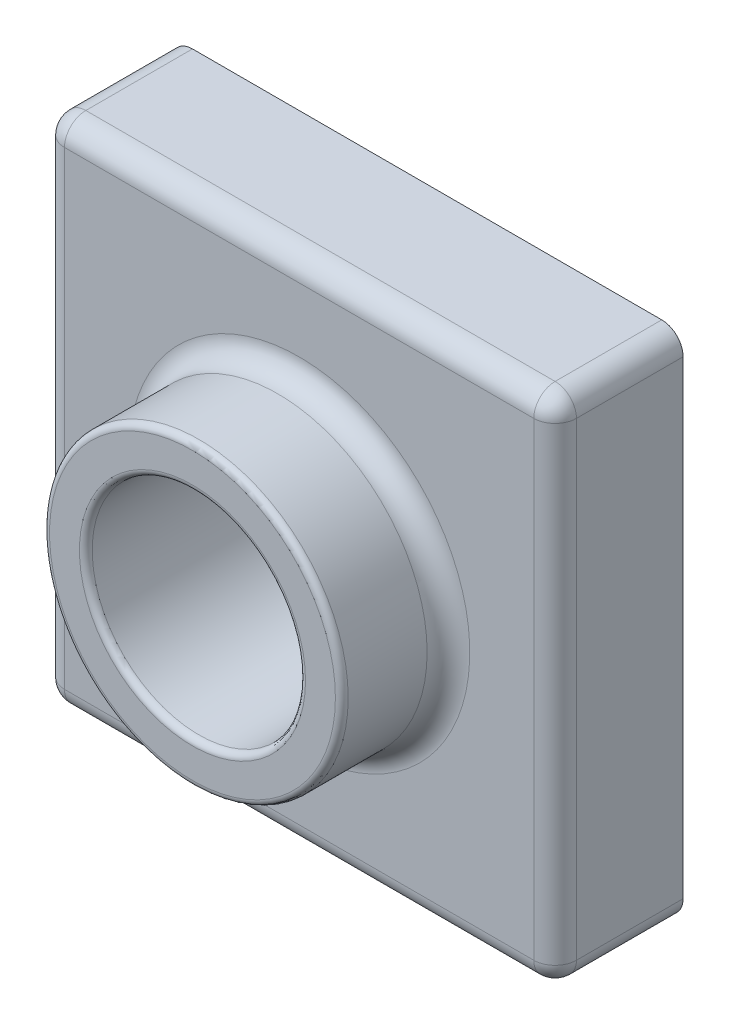
ISO-10303-21;
HEADER;
FILE_DESCRIPTION(('STEP AP214'),'2;1');
FILE_NAME('part.step','',(''),(''),'','','');
FILE_SCHEMA(('AUTOMOTIVE_DESIGN { 1 0 10303 214 1 1 1 1 }'));
ENDSEC;
DATA;
#1=APPLICATION_CONTEXT('core data for automotive mechanical design processes');
#2=APPLICATION_PROTOCOL_DEFINITION('international standard','automotive_design',2000,#1);
#3=PRODUCT_CONTEXT('',#1,'mechanical');
#4=PRODUCT('Part','Part','',(#3));
#5=PRODUCT_RELATED_PRODUCT_CATEGORY('part','',(#4));
#6=PRODUCT_DEFINITION_FORMATION('','',#4);
#7=PRODUCT_DEFINITION_CONTEXT('part definition',#1,'design');
#8=PRODUCT_DEFINITION('design','',#6,#7);
#9=PRODUCT_DEFINITION_SHAPE('','',#8);
#10=(LENGTH_UNIT() NAMED_UNIT(*) SI_UNIT(.MILLI.,.METRE.));
#11=(NAMED_UNIT(*) PLANE_ANGLE_UNIT() SI_UNIT($,.RADIAN.));
#12=(NAMED_UNIT(*) SI_UNIT($,.STERADIAN.) SOLID_ANGLE_UNIT());
#13=UNCERTAINTY_MEASURE_WITH_UNIT(LENGTH_MEASURE(1.E-05),#10,'distance_accuracy_value','');
#14=(GEOMETRIC_REPRESENTATION_CONTEXT(3) GLOBAL_UNCERTAINTY_ASSIGNED_CONTEXT((#13)) GLOBAL_UNIT_ASSIGNED_CONTEXT((#10,
#11,#12)) REPRESENTATION_CONTEXT('',''));
#15=CARTESIAN_POINT('',(0.,0.,0.));
#16=DIRECTION('',(0.,0.,1.));
#17=DIRECTION('',(1.,0.,0.));
#18=AXIS2_PLACEMENT_3D('',#15,#16,#17);
#19=CARTESIAN_POINT('',(0.,120.,0.));
#20=DIRECTION('',(0.,0.,-1.));
#21=DIRECTION('',(-1.,0.,0.));
#22=AXIS2_PLACEMENT_3D('',#19,#20,#21);
#23=PLANE('',#22);
#24=DIRECTION('',(1.,0.,0.));
#25=VECTOR('',#24,1.);
#26=CARTESIAN_POINT('',(0.,0.,0.));
#27=LINE('',#26,#25);
#28=CARTESIAN_POINT('',(5.,0.,0.));
#29=VERTEX_POINT('',#28);
#30=CARTESIAN_POINT('',(115.,0.,0.));
#31=VERTEX_POINT('',#30);
#32=EDGE_CURVE('E306',#29,#31,#27,.T.);
#33=ORIENTED_EDGE('',*,*,#32,.F.);
#34=CARTESIAN_POINT('',(5.,5.,0.));
#35=DIRECTION('',(0.,0.,-1.));
#36=DIRECTION('',(-1.,0.,0.));
#37=AXIS2_PLACEMENT_3D('',#34,#35,#36);
#38=CIRCLE('',#37,5.);
#39=CARTESIAN_POINT('',(0.,5.,0.));
#40=VERTEX_POINT('',#39);
#41=EDGE_CURVE('E360',#29,#40,#38,.T.);
#42=ORIENTED_EDGE('',*,*,#41,.T.);
#43=DIRECTION('',(0.,-1.,0.));
#44=VECTOR('',#43,1.);
#45=CARTESIAN_POINT('',(0.,0.,0.));
#46=LINE('',#45,#44);
#47=CARTESIAN_POINT('',(0.,115.,0.));
#48=VERTEX_POINT('',#47);
#49=EDGE_CURVE('E303',#48,#40,#46,.T.);
#50=ORIENTED_EDGE('',*,*,#49,.F.);
#51=CARTESIAN_POINT('',(5.,115.,0.));
#52=DIRECTION('',(0.,0.,-1.));
#53=DIRECTION('',(-1.,0.,0.));
#54=AXIS2_PLACEMENT_3D('',#51,#52,#53);
#55=CIRCLE('',#54,5.);
#56=CARTESIAN_POINT('',(5.,120.,0.));
#57=VERTEX_POINT('',#56);
#58=EDGE_CURVE('E354',#48,#57,#55,.T.);
#59=ORIENTED_EDGE('',*,*,#58,.T.);
#60=DIRECTION('',(-1.,0.,0.));
#61=VECTOR('',#60,1.);
#62=CARTESIAN_POINT('',(0.,120.,0.));
#63=LINE('',#62,#61);
#64=CARTESIAN_POINT('',(115.,120.,0.));
#65=VERTEX_POINT('',#64);
#66=EDGE_CURVE('E312',#65,#57,#63,.T.);
#67=ORIENTED_EDGE('',*,*,#66,.F.);
#68=CARTESIAN_POINT('',(115.,115.,0.));
#69=DIRECTION('',(0.,0.,-1.));
#70=DIRECTION('',(-1.,0.,0.));
#71=AXIS2_PLACEMENT_3D('',#68,#69,#70);
#72=CIRCLE('',#71,5.);
#73=CARTESIAN_POINT('',(120.,115.,0.));
#74=VERTEX_POINT('',#73);
#75=EDGE_CURVE('E356',#65,#74,#72,.T.);
#76=ORIENTED_EDGE('',*,*,#75,.T.);
#77=DIRECTION('',(0.,1.,0.));
#78=VECTOR('',#77,1.);
#79=CARTESIAN_POINT('',(120.,0.,0.));
#80=LINE('',#79,#78);
#81=CARTESIAN_POINT('',(120.,5.,0.));
#82=VERTEX_POINT('',#81);
#83=EDGE_CURVE('E309',#82,#74,#80,.T.);
#84=ORIENTED_EDGE('',*,*,#83,.F.);
#85=CARTESIAN_POINT('',(115.,5.,0.));
#86=DIRECTION('',(0.,0.,-1.));
#87=DIRECTION('',(-1.,0.,0.));
#88=AXIS2_PLACEMENT_3D('',#85,#86,#87);
#89=CIRCLE('',#88,5.);
#90=EDGE_CURVE('E358',#82,#31,#89,.T.);
#91=ORIENTED_EDGE('',*,*,#90,.T.);
#92=EDGE_LOOP('',(#33,#42,#50,#59,#67,#76,#84,#91));
#93=FACE_BOUND('',#92,.T.);
#94=CARTESIAN_POINT('',(5.,5.,0.));
#95=DIRECTION('',(0.,0.,-1.));
#96=DIRECTION('',(-1.,0.,0.));
#97=AXIS2_PLACEMENT_3D('',#94,#95,#96);
#98=CIRCLE('',#97,3.);
#99=CARTESIAN_POINT('',(5.,2.,0.));
#100=VERTEX_POINT('',#99);
#101=CARTESIAN_POINT('',(2.,5.,0.));
#102=VERTEX_POINT('',#101);
#103=EDGE_CURVE('E233',#100,#102,#98,.T.);
#104=ORIENTED_EDGE('',*,*,#103,.F.);
#105=DIRECTION('',(1.,0.,0.));
#106=VECTOR('',#105,1.);
#107=CARTESIAN_POINT('',(0.,2.,0.));
#108=LINE('',#107,#106);
#109=CARTESIAN_POINT('',(115.,2.,0.));
#110=VERTEX_POINT('',#109);
#111=EDGE_CURVE('E286',#100,#110,#108,.T.);
#112=ORIENTED_EDGE('',*,*,#111,.T.);
#113=CARTESIAN_POINT('',(115.,5.,0.));
#114=DIRECTION('',(0.,0.,-1.));
#115=DIRECTION('',(-1.,0.,0.));
#116=AXIS2_PLACEMENT_3D('',#113,#114,#115);
#117=CIRCLE('',#116,3.);
#118=CARTESIAN_POINT('',(118.,5.,0.));
#119=VERTEX_POINT('',#118);
#120=EDGE_CURVE('E290',#119,#110,#117,.T.);
#121=ORIENTED_EDGE('',*,*,#120,.F.);
#122=DIRECTION('',(0.,1.,0.));
#123=VECTOR('',#122,1.);
#124=CARTESIAN_POINT('',(118.,120.,0.));
#125=LINE('',#124,#123);
#126=CARTESIAN_POINT('',(118.,115.,0.));
#127=VERTEX_POINT('',#126);
#128=EDGE_CURVE('E57',#119,#127,#125,.T.);
#129=ORIENTED_EDGE('',*,*,#128,.T.);
#130=CARTESIAN_POINT('',(115.,115.,0.));
#131=DIRECTION('',(0.,0.,-1.));
#132=DIRECTION('',(-1.,0.,0.));
#133=AXIS2_PLACEMENT_3D('',#130,#131,#132);
#134=CIRCLE('',#133,3.);
#135=CARTESIAN_POINT('',(115.,118.,0.));
#136=VERTEX_POINT('',#135);
#137=EDGE_CURVE('E294',#136,#127,#134,.T.);
#138=ORIENTED_EDGE('',*,*,#137,.F.);
#139=DIRECTION('',(-1.,0.,0.));
#140=VECTOR('',#139,1.);
#141=CARTESIAN_POINT('',(0.,118.,0.));
#142=LINE('',#141,#140);
#143=CARTESIAN_POINT('',(5.,118.,0.));
#144=VERTEX_POINT('',#143);
#145=EDGE_CURVE('E228',#136,#144,#142,.T.);
#146=ORIENTED_EDGE('',*,*,#145,.T.);
#147=CARTESIAN_POINT('',(5.,115.,0.));
#148=DIRECTION('',(0.,0.,-1.));
#149=DIRECTION('',(-1.,0.,0.));
#150=AXIS2_PLACEMENT_3D('',#147,#148,#149);
#151=CIRCLE('',#150,3.);
#152=CARTESIAN_POINT('',(2.,115.,0.));
#153=VERTEX_POINT('',#152);
#154=EDGE_CURVE('E274',#153,#144,#151,.T.);
#155=ORIENTED_EDGE('',*,*,#154,.F.);
#156=DIRECTION('',(0.,-1.,0.));
#157=VECTOR('',#156,1.);
#158=CARTESIAN_POINT('',(2.,120.,0.));
#159=LINE('',#158,#157);
#160=EDGE_CURVE('E285',#153,#102,#159,.T.);
#161=ORIENTED_EDGE('',*,*,#160,.T.);
#162=EDGE_LOOP('',(#104,#112,#121,#129,#138,#146,#155,#161));
#163=FACE_BOUND('',#162,.T.);
#164=ADVANCED_FACE('F42',(#93,#163),#23,.T.);
#165=CARTESIAN_POINT('',(0.,120.,30.));
#166=DIRECTION('',(0.,0.,-1.));
#167=DIRECTION('',(-1.,0.,0.));
#168=AXIS2_PLACEMENT_3D('',#165,#166,#167);
#169=PLANE('',#168);
#170=CARTESIAN_POINT('',(60.,60.,30.));
#171=DIRECTION('',(0.,0.,-1.));
#172=DIRECTION('',(-1.,0.,0.));
#173=AXIS2_PLACEMENT_3D('',#170,#171,#172);
#174=CIRCLE('',#173,40.);
#175=CARTESIAN_POINT('',(20.,60.,30.));
#176=VERTEX_POINT('',#175);
#177=EDGE_CURVE('E327',#176,#176,#174,.T.);
#178=ORIENTED_EDGE('',*,*,#177,.T.);
#179=EDGE_LOOP('',(#178));
#180=FACE_BOUND('',#179,.T.);
#181=DIRECTION('',(0.,1.,0.));
#182=VECTOR('',#181,1.);
#183=CARTESIAN_POINT('',(115.,120.,30.));
#184=LINE('',#183,#182);
#185=CARTESIAN_POINT('',(115.,5.,30.));
#186=VERTEX_POINT('',#185);
#187=CARTESIAN_POINT('',(115.,115.,30.));
#188=VERTEX_POINT('',#187);
#189=EDGE_CURVE('E322',#186,#188,#184,.T.);
#190=ORIENTED_EDGE('',*,*,#189,.T.);
#191=DIRECTION('',(-1.,0.,0.));
#192=VECTOR('',#191,1.);
#193=CARTESIAN_POINT('',(0.,115.,30.));
#194=LINE('',#193,#192);
#195=CARTESIAN_POINT('',(5.,115.,30.));
#196=VERTEX_POINT('',#195);
#197=EDGE_CURVE('E324',#188,#196,#194,.T.);
#198=ORIENTED_EDGE('',*,*,#197,.T.);
#199=DIRECTION('',(0.,-1.,0.));
#200=VECTOR('',#199,1.);
#201=CARTESIAN_POINT('',(5.,120.,30.));
#202=LINE('',#201,#200);
#203=CARTESIAN_POINT('',(5.,5.,30.));
#204=VERTEX_POINT('',#203);
#205=EDGE_CURVE('E318',#196,#204,#202,.T.);
#206=ORIENTED_EDGE('',*,*,#205,.T.);
#207=DIRECTION('',(1.,0.,0.));
#208=VECTOR('',#207,1.);
#209=CARTESIAN_POINT('',(0.,5.,30.));
#210=LINE('',#209,#208);
#211=EDGE_CURVE('E320',#204,#186,#210,.T.);
#212=ORIENTED_EDGE('',*,*,#211,.T.);
#213=EDGE_LOOP('',(#190,#198,#206,#212));
#214=FACE_BOUND('',#213,.T.);
#215=ADVANCED_FACE('F444',(#180,#214),#169,.F.);
#216=CARTESIAN_POINT('',(0.,0.,30.));
#217=DIRECTION('',(1.,0.,0.));
#218=DIRECTION('',(0.,0.,-1.));
#219=AXIS2_PLACEMENT_3D('',#216,#217,#218);
#220=PLANE('',#219);
#221=ORIENTED_EDGE('',*,*,#49,.T.);
#222=DIRECTION('',(0.,0.,-1.));
#223=VECTOR('',#222,1.);
#224=CARTESIAN_POINT('',(0.,5.,30.));
#225=LINE('',#224,#223);
#226=CARTESIAN_POINT('',(0.,5.,25.));
#227=VERTEX_POINT('',#226);
#228=EDGE_CURVE('E65',#40,#227,#225,.F.);
#229=ORIENTED_EDGE('',*,*,#228,.T.);
#230=DIRECTION('',(0.,-1.,0.));
#231=VECTOR('',#230,1.);
#232=CARTESIAN_POINT('',(0.,0.,25.));
#233=LINE('',#232,#231);
#234=CARTESIAN_POINT('',(0.,115.,25.));
#235=VERTEX_POINT('',#234);
#236=EDGE_CURVE('E351',#227,#235,#233,.F.);
#237=ORIENTED_EDGE('',*,*,#236,.T.);
#238=DIRECTION('',(0.,0.,-1.));
#239=VECTOR('',#238,1.);
#240=CARTESIAN_POINT('',(0.,115.,30.));
#241=LINE('',#240,#239);
#242=EDGE_CURVE('E349',#235,#48,#241,.T.);
#243=ORIENTED_EDGE('',*,*,#242,.T.);
#244=EDGE_LOOP('',(#221,#229,#237,#243));
#245=FACE_BOUND('',#244,.T.);
#246=ADVANCED_FACE('F449',(#245),#220,.F.);
#247=CARTESIAN_POINT('',(0.,0.,30.));
#248=DIRECTION('',(0.,1.,0.));
#249=DIRECTION('',(0.,0.,1.));
#250=AXIS2_PLACEMENT_3D('',#247,#248,#249);
#251=PLANE('',#250);
#252=DIRECTION('',(1.,0.,0.));
#253=VECTOR('',#252,1.);
#254=CARTESIAN_POINT('',(0.,0.,25.));
#255=LINE('',#254,#253);
#256=CARTESIAN_POINT('',(115.,0.,25.));
#257=VERTEX_POINT('',#256);
#258=CARTESIAN_POINT('',(5.,0.,25.));
#259=VERTEX_POINT('',#258);
#260=EDGE_CURVE('E345',#257,#259,#255,.F.);
#261=ORIENTED_EDGE('',*,*,#260,.T.);
#262=DIRECTION('',(0.,0.,-1.));
#263=VECTOR('',#262,1.);
#264=CARTESIAN_POINT('',(5.,0.,30.));
#265=LINE('',#264,#263);
#266=EDGE_CURVE('E347',#259,#29,#265,.T.);
#267=ORIENTED_EDGE('',*,*,#266,.T.);
#268=ORIENTED_EDGE('',*,*,#32,.T.);
#269=DIRECTION('',(0.,0.,-1.));
#270=VECTOR('',#269,1.);
#271=CARTESIAN_POINT('',(115.,0.,30.));
#272=LINE('',#271,#270);
#273=EDGE_CURVE('E343',#31,#257,#272,.F.);
#274=ORIENTED_EDGE('',*,*,#273,.T.);
#275=EDGE_LOOP('',(#261,#267,#268,#274));
#276=FACE_BOUND('',#275,.T.);
#277=ADVANCED_FACE('F883',(#276),#251,.F.);
#278=CARTESIAN_POINT('',(120.,0.,30.));
#279=DIRECTION('',(-1.,0.,0.));
#280=DIRECTION('',(0.,0.,1.));
#281=AXIS2_PLACEMENT_3D('',#278,#279,#280);
#282=PLANE('',#281);
#283=DIRECTION('',(0.,1.,0.));
#284=VECTOR('',#283,1.);
#285=CARTESIAN_POINT('',(120.,0.,25.));
#286=LINE('',#285,#284);
#287=CARTESIAN_POINT('',(120.,115.,25.));
#288=VERTEX_POINT('',#287);
#289=CARTESIAN_POINT('',(120.,5.,25.));
#290=VERTEX_POINT('',#289);
#291=EDGE_CURVE('E339',#288,#290,#286,.F.);
#292=ORIENTED_EDGE('',*,*,#291,.T.);
#293=DIRECTION('',(0.,0.,-1.));
#294=VECTOR('',#293,1.);
#295=CARTESIAN_POINT('',(120.,5.,30.));
#296=LINE('',#295,#294);
#297=EDGE_CURVE('E341',#290,#82,#296,.T.);
#298=ORIENTED_EDGE('',*,*,#297,.T.);
#299=ORIENTED_EDGE('',*,*,#83,.T.);
#300=DIRECTION('',(0.,0.,-1.));
#301=VECTOR('',#300,1.);
#302=CARTESIAN_POINT('',(120.,115.,30.));
#303=LINE('',#302,#301);
#304=EDGE_CURVE('E337',#74,#288,#303,.F.);
#305=ORIENTED_EDGE('',*,*,#304,.T.);
#306=EDGE_LOOP('',(#292,#298,#299,#305));
#307=FACE_BOUND('',#306,.T.);
#308=ADVANCED_FACE('F438',(#307),#282,.F.);
#309=CARTESIAN_POINT('',(0.,120.,30.));
#310=DIRECTION('',(0.,-1.,0.));
#311=DIRECTION('',(0.,0.,-1.));
#312=AXIS2_PLACEMENT_3D('',#309,#310,#311);
#313=PLANE('',#312);
#314=DIRECTION('',(-1.,0.,0.));
#315=VECTOR('',#314,1.);
#316=CARTESIAN_POINT('',(0.,120.,25.));
#317=LINE('',#316,#315);
#318=CARTESIAN_POINT('',(5.,120.,25.));
#319=VERTEX_POINT('',#318);
#320=CARTESIAN_POINT('',(115.,120.,25.));
#321=VERTEX_POINT('',#320);
#322=EDGE_CURVE('E332',#319,#321,#317,.F.);
#323=ORIENTED_EDGE('',*,*,#322,.T.);
#324=DIRECTION('',(0.,0.,-1.));
#325=VECTOR('',#324,1.);
#326=CARTESIAN_POINT('',(115.,120.,30.));
#327=LINE('',#326,#325);
#328=EDGE_CURVE('E335',#321,#65,#327,.T.);
#329=ORIENTED_EDGE('',*,*,#328,.T.);
#330=ORIENTED_EDGE('',*,*,#66,.T.);
#331=DIRECTION('',(0.,0.,-1.));
#332=VECTOR('',#331,1.);
#333=CARTESIAN_POINT('',(5.,120.,30.));
#334=LINE('',#333,#332);
#335=EDGE_CURVE('E330',#57,#319,#334,.F.);
#336=ORIENTED_EDGE('',*,*,#335,.T.);
#337=EDGE_LOOP('',(#323,#329,#330,#336));
#338=FACE_BOUND('',#337,.T.);
#339=ADVANCED_FACE('F430',(#338),#313,.F.);
#340=CARTESIAN_POINT('',(60.,60.,0.));
#341=DIRECTION('',(0.,0.,-1.));
#342=DIRECTION('',(-1.,0.,0.));
#343=AXIS2_PLACEMENT_3D('',#340,#341,#342);
#344=CIRCLE('',#343,27.);
#345=CARTESIAN_POINT('',(33.,60.,0.));
#346=VERTEX_POINT('',#345);
#347=EDGE_CURVE('E257',#346,#346,#344,.F.);
#348=ORIENTED_EDGE('',*,*,#347,.F.);
#349=EDGE_LOOP('',(#348));
#350=FACE_BOUND('',#349,.T.);
#351=CARTESIAN_POINT('',(60.,60.,0.));
#352=DIRECTION('',(0.,0.,1.));
#353=DIRECTION('',(1.,0.,0.));
#354=AXIS2_PLACEMENT_3D('',#351,#352,#353);
#355=CIRCLE('',#354,25.);
#356=CARTESIAN_POINT('',(85.,60.,0.));
#357=VERTEX_POINT('',#356);
#358=EDGE_CURVE('E300',#357,#357,#355,.T.);
#359=ORIENTED_EDGE('',*,*,#358,.T.);
#360=EDGE_LOOP('',(#359));
#361=FACE_BOUND('',#360,.T.);
#362=ADVANCED_FACE('F428',(#350,#361),#23,.T.);
#363=CARTESIAN_POINT('',(60.,60.,55.));
#364=DIRECTION('',(0.,0.,-1.));
#365=DIRECTION('',(-1.,0.,0.));
#366=AXIS2_PLACEMENT_3D('',#363,#364,#365);
#367=CYLINDRICAL_SURFACE('',#366,35.);
#368=CARTESIAN_POINT('',(60.,60.,53.5));
#369=DIRECTION('',(0.,0.,1.));
#370=DIRECTION('',(1.,0.,0.));
#371=AXIS2_PLACEMENT_3D('',#368,#369,#370);
#372=CIRCLE('',#371,35.);
#373=CARTESIAN_POINT('',(95.,60.,53.5));
#374=VERTEX_POINT('',#373);
#375=EDGE_CURVE('E50',#374,#374,#372,.F.);
#376=ORIENTED_EDGE('',*,*,#375,.T.);
#377=EDGE_LOOP('',(#376));
#378=FACE_BOUND('',#377,.T.);
#379=CARTESIAN_POINT('',(60.,60.,35.));
#380=DIRECTION('',(0.,0.,-1.));
#381=DIRECTION('',(-1.,0.,0.));
#382=AXIS2_PLACEMENT_3D('',#379,#380,#381);
#383=CIRCLE('',#382,35.);
#384=CARTESIAN_POINT('',(25.,60.,35.));
#385=VERTEX_POINT('',#384);
#386=EDGE_CURVE('E315',#385,#385,#383,.F.);
#387=ORIENTED_EDGE('',*,*,#386,.T.);
#388=EDGE_LOOP('',(#387));
#389=FACE_BOUND('',#388,.T.);
#390=ADVANCED_FACE('F402',(#378,#389),#367,.T.);
#391=CARTESIAN_POINT('',(60.,60.,55.));
#392=DIRECTION('',(0.,0.,1.));
#393=DIRECTION('',(1.,0.,0.));
#394=AXIS2_PLACEMENT_3D('',#391,#392,#393);
#395=PLANE('',#394);
#396=CARTESIAN_POINT('',(60.,60.,55.));
#397=DIRECTION('',(0.,0.,1.));
#398=DIRECTION('',(1.,0.,0.));
#399=AXIS2_PLACEMENT_3D('',#396,#397,#398);
#400=CIRCLE('',#399,33.5);
#401=CARTESIAN_POINT('',(93.5,60.,55.));
#402=VERTEX_POINT('',#401);
#403=EDGE_CURVE('E397',#402,#402,#400,.T.);
#404=ORIENTED_EDGE('',*,*,#403,.T.);
#405=EDGE_LOOP('',(#404));
#406=FACE_BOUND('',#405,.T.);
#407=CARTESIAN_POINT('',(60.,60.,55.));
#408=DIRECTION('',(0.,0.,1.));
#409=DIRECTION('',(1.,0.,0.));
#410=AXIS2_PLACEMENT_3D('',#407,#408,#409);
#411=CIRCLE('',#410,26.5);
#412=CARTESIAN_POINT('',(86.5,60.,55.));
#413=VERTEX_POINT('',#412);
#414=EDGE_CURVE('E362',#413,#413,#411,.F.);
#415=ORIENTED_EDGE('',*,*,#414,.T.);
#416=EDGE_LOOP('',(#415));
#417=FACE_BOUND('',#416,.T.);
#418=ADVANCED_FACE('F411',(#406,#417),#395,.T.);
#419=CARTESIAN_POINT('',(60.,60.,0.));
#420=DIRECTION('',(0.,0.,1.));
#421=DIRECTION('',(1.,0.,0.));
#422=AXIS2_PLACEMENT_3D('',#419,#420,#421);
#423=CYLINDRICAL_SURFACE('',#422,25.);
#424=CARTESIAN_POINT('',(60.,60.,53.5));
#425=DIRECTION('',(0.,0.,1.));
#426=DIRECTION('',(1.,0.,0.));
#427=AXIS2_PLACEMENT_3D('',#424,#425,#426);
#428=CIRCLE('',#427,25.);
#429=CARTESIAN_POINT('',(85.,60.,53.5));
#430=VERTEX_POINT('',#429);
#431=EDGE_CURVE('E11',#430,#430,#428,.T.);
#432=ORIENTED_EDGE('',*,*,#431,.T.);
#433=EDGE_LOOP('',(#432));
#434=FACE_BOUND('',#433,.T.);
#435=ORIENTED_EDGE('',*,*,#358,.F.);
#436=EDGE_LOOP('',(#435));
#437=FACE_BOUND('',#436,.T.);
#438=ADVANCED_FACE('F414',(#434,#437),#423,.F.);
#439=CARTESIAN_POINT('',(60.,60.,35.));
#440=DIRECTION('',(0.,0.,-1.));
#441=DIRECTION('',(-1.,0.,0.));
#442=AXIS2_PLACEMENT_3D('',#439,#440,#441);
#443=TOROIDAL_SURFACE('',#442,40.,5.);
#444=ORIENTED_EDGE('',*,*,#177,.F.);
#445=EDGE_LOOP('',(#444));
#446=FACE_BOUND('',#445,.T.);
#447=ORIENTED_EDGE('',*,*,#386,.F.);
#448=EDGE_LOOP('',(#447));
#449=FACE_BOUND('',#448,.T.);
#450=ADVANCED_FACE('F424',(#446,#449),#443,.F.);
#451=CARTESIAN_POINT('',(115.,5.,30.));
#452=DIRECTION('',(0.,0.,-1.));
#453=DIRECTION('',(-1.,0.,0.));
#454=AXIS2_PLACEMENT_3D('',#451,#452,#453);
#455=CYLINDRICAL_SURFACE('',#454,5.);
#456=ORIENTED_EDGE('',*,*,#90,.F.);
#457=ORIENTED_EDGE('',*,*,#297,.F.);
#458=CARTESIAN_POINT('',(115.,5.,25.));
#459=DIRECTION('',(0.,0.,1.));
#460=DIRECTION('',(1.,0.,0.));
#461=AXIS2_PLACEMENT_3D('',#458,#459,#460);
#462=CIRCLE('',#461,5.);
#463=EDGE_CURVE('E304',#257,#290,#462,.T.);
#464=ORIENTED_EDGE('',*,*,#463,.F.);
#465=ORIENTED_EDGE('',*,*,#273,.F.);
#466=EDGE_LOOP('',(#456,#457,#464,#465));
#467=FACE_BOUND('',#466,.T.);
#468=ADVANCED_FACE('F851',(#467),#455,.T.);
#469=CARTESIAN_POINT('',(0.,5.,25.));
#470=DIRECTION('',(1.,0.,0.));
#471=DIRECTION('',(0.,0.,-1.));
#472=AXIS2_PLACEMENT_3D('',#469,#470,#471);
#473=CYLINDRICAL_SURFACE('',#472,5.);
#474=CARTESIAN_POINT('',(5.,5.,25.));
#475=DIRECTION('',(-1.,0.,0.));
#476=DIRECTION('',(0.,0.,1.));
#477=AXIS2_PLACEMENT_3D('',#474,#475,#476);
#478=CIRCLE('',#477,5.);
#479=EDGE_CURVE('E387',#259,#204,#478,.T.);
#480=ORIENTED_EDGE('',*,*,#479,.F.);
#481=ORIENTED_EDGE('',*,*,#260,.F.);
#482=CARTESIAN_POINT('',(115.,5.,25.));
#483=DIRECTION('',(1.,0.,0.));
#484=DIRECTION('',(0.,0.,-1.));
#485=AXIS2_PLACEMENT_3D('',#482,#483,#484);
#486=CIRCLE('',#485,5.);
#487=EDGE_CURVE('E390',#186,#257,#486,.T.);
#488=ORIENTED_EDGE('',*,*,#487,.F.);
#489=ORIENTED_EDGE('',*,*,#211,.F.);
#490=EDGE_LOOP('',(#480,#481,#488,#489));
#491=FACE_BOUND('',#490,.T.);
#492=ADVANCED_FACE('F841',(#491),#473,.T.);
#493=CARTESIAN_POINT('',(5.,5.,30.));
#494=DIRECTION('',(0.,0.,-1.));
#495=DIRECTION('',(-1.,0.,0.));
#496=AXIS2_PLACEMENT_3D('',#493,#494,#495);
#497=CYLINDRICAL_SURFACE('',#496,5.);
#498=ORIENTED_EDGE('',*,*,#41,.F.);
#499=ORIENTED_EDGE('',*,*,#266,.F.);
#500=CARTESIAN_POINT('',(5.,5.,25.));
#501=DIRECTION('',(0.,0.,1.));
#502=DIRECTION('',(1.,0.,0.));
#503=AXIS2_PLACEMENT_3D('',#500,#501,#502);
#504=CIRCLE('',#503,5.);
#505=EDGE_CURVE('E384',#227,#259,#504,.T.);
#506=ORIENTED_EDGE('',*,*,#505,.F.);
#507=ORIENTED_EDGE('',*,*,#228,.F.);
#508=EDGE_LOOP('',(#498,#499,#506,#507));
#509=FACE_BOUND('',#508,.T.);
#510=ADVANCED_FACE('F831',(#509),#497,.T.);
#511=CARTESIAN_POINT('',(115.,5.,25.));
#512=DIRECTION('',(0.,0.,1.));
#513=DIRECTION('',(1.,0.,0.));
#514=AXIS2_PLACEMENT_3D('',#511,#512,#513);
#515=SPHERICAL_SURFACE('',#514,5.);
#516=ORIENTED_EDGE('',*,*,#487,.T.);
#517=ORIENTED_EDGE('',*,*,#463,.T.);
#518=CARTESIAN_POINT('',(115.,5.,25.));
#519=DIRECTION('',(0.,-1.,0.));
#520=DIRECTION('',(0.,0.,-1.));
#521=AXIS2_PLACEMENT_3D('',#518,#519,#520);
#522=CIRCLE('',#521,5.);
#523=EDGE_CURVE('E381',#186,#290,#522,.F.);
#524=ORIENTED_EDGE('',*,*,#523,.F.);
#525=EDGE_LOOP('',(#516,#517,#524));
#526=FACE_BOUND('',#525,.T.);
#527=ADVANCED_FACE('F821',(#526),#515,.T.);
#528=CARTESIAN_POINT('',(5.,5.,25.));
#529=DIRECTION('',(0.,0.,1.));
#530=DIRECTION('',(1.,0.,0.));
#531=AXIS2_PLACEMENT_3D('',#528,#529,#530);
#532=SPHERICAL_SURFACE('',#531,5.);
#533=ORIENTED_EDGE('',*,*,#505,.T.);
#534=ORIENTED_EDGE('',*,*,#479,.T.);
#535=CARTESIAN_POINT('',(5.,5.,25.));
#536=DIRECTION('',(0.,-1.,0.));
#537=DIRECTION('',(1.,0.,0.));
#538=AXIS2_PLACEMENT_3D('',#535,#536,#537);
#539=CIRCLE('',#538,5.);
#540=EDGE_CURVE('E378',#227,#204,#539,.F.);
#541=ORIENTED_EDGE('',*,*,#540,.F.);
#542=EDGE_LOOP('',(#533,#534,#541));
#543=FACE_BOUND('',#542,.T.);
#544=ADVANCED_FACE('F811',(#543),#532,.T.);
#545=CARTESIAN_POINT('',(115.,115.,30.));
#546=DIRECTION('',(0.,0.,-1.));
#547=DIRECTION('',(-1.,0.,0.));
#548=AXIS2_PLACEMENT_3D('',#545,#546,#547);
#549=CYLINDRICAL_SURFACE('',#548,5.);
#550=ORIENTED_EDGE('',*,*,#75,.F.);
#551=ORIENTED_EDGE('',*,*,#328,.F.);
#552=CARTESIAN_POINT('',(115.,115.,25.));
#553=DIRECTION('',(0.,0.,1.));
#554=DIRECTION('',(1.,0.,0.));
#555=AXIS2_PLACEMENT_3D('',#552,#553,#554);
#556=CIRCLE('',#555,5.);
#557=EDGE_CURVE('E375',#288,#321,#556,.T.);
#558=ORIENTED_EDGE('',*,*,#557,.F.);
#559=ORIENTED_EDGE('',*,*,#304,.F.);
#560=EDGE_LOOP('',(#550,#551,#558,#559));
#561=FACE_BOUND('',#560,.T.);
#562=ADVANCED_FACE('F801',(#561),#549,.T.);
#563=CARTESIAN_POINT('',(115.,120.,25.));
#564=DIRECTION('',(0.,1.,0.));
#565=DIRECTION('',(0.,0.,1.));
#566=AXIS2_PLACEMENT_3D('',#563,#564,#565);
#567=CYLINDRICAL_SURFACE('',#566,5.);
#568=ORIENTED_EDGE('',*,*,#523,.T.);
#569=ORIENTED_EDGE('',*,*,#291,.F.);
#570=CARTESIAN_POINT('',(115.,115.,25.));
#571=DIRECTION('',(0.,1.,0.));
#572=DIRECTION('',(0.,0.,1.));
#573=AXIS2_PLACEMENT_3D('',#570,#571,#572);
#574=CIRCLE('',#573,5.);
#575=EDGE_CURVE('E372',#188,#288,#574,.T.);
#576=ORIENTED_EDGE('',*,*,#575,.F.);
#577=ORIENTED_EDGE('',*,*,#189,.F.);
#578=EDGE_LOOP('',(#568,#569,#576,#577));
#579=FACE_BOUND('',#578,.T.);
#580=ADVANCED_FACE('F791',(#579),#567,.T.);
#581=CARTESIAN_POINT('',(5.,120.,25.));
#582=DIRECTION('',(0.,-1.,0.));
#583=DIRECTION('',(0.,0.,-1.));
#584=AXIS2_PLACEMENT_3D('',#581,#582,#583);
#585=CYLINDRICAL_SURFACE('',#584,5.);
#586=ORIENTED_EDGE('',*,*,#540,.T.);
#587=ORIENTED_EDGE('',*,*,#205,.F.);
#588=CARTESIAN_POINT('',(5.,115.,25.));
#589=DIRECTION('',(0.,1.,0.));
#590=DIRECTION('',(0.,0.,1.));
#591=AXIS2_PLACEMENT_3D('',#588,#589,#590);
#592=CIRCLE('',#591,5.);
#593=EDGE_CURVE('E369',#235,#196,#592,.T.);
#594=ORIENTED_EDGE('',*,*,#593,.F.);
#595=ORIENTED_EDGE('',*,*,#236,.F.);
#596=EDGE_LOOP('',(#586,#587,#594,#595));
#597=FACE_BOUND('',#596,.T.);
#598=ADVANCED_FACE('F781',(#597),#585,.T.);
#599=CARTESIAN_POINT('',(5.,115.,30.));
#600=DIRECTION('',(0.,0.,-1.));
#601=DIRECTION('',(-1.,0.,0.));
#602=AXIS2_PLACEMENT_3D('',#599,#600,#601);
#603=CYLINDRICAL_SURFACE('',#602,5.);
#604=ORIENTED_EDGE('',*,*,#58,.F.);
#605=ORIENTED_EDGE('',*,*,#242,.F.);
#606=CARTESIAN_POINT('',(5.,115.,25.));
#607=DIRECTION('',(0.,0.,1.));
#608=DIRECTION('',(1.,0.,0.));
#609=AXIS2_PLACEMENT_3D('',#606,#607,#608);
#610=CIRCLE('',#609,5.);
#611=EDGE_CURVE('E366',#319,#235,#610,.T.);
#612=ORIENTED_EDGE('',*,*,#611,.F.);
#613=ORIENTED_EDGE('',*,*,#335,.F.);
#614=EDGE_LOOP('',(#604,#605,#612,#613));
#615=FACE_BOUND('',#614,.T.);
#616=ADVANCED_FACE('F771',(#615),#603,.T.);
#617=CARTESIAN_POINT('',(115.,115.,25.));
#618=DIRECTION('',(0.,0.,1.));
#619=DIRECTION('',(1.,0.,0.));
#620=AXIS2_PLACEMENT_3D('',#617,#618,#619);
#621=SPHERICAL_SURFACE('',#620,5.);
#622=ORIENTED_EDGE('',*,*,#575,.T.);
#623=ORIENTED_EDGE('',*,*,#557,.T.);
#624=CARTESIAN_POINT('',(115.,115.,25.));
#625=DIRECTION('',(1.,0.,0.));
#626=DIRECTION('',(0.,0.,-1.));
#627=AXIS2_PLACEMENT_3D('',#624,#625,#626);
#628=CIRCLE('',#627,5.);
#629=EDGE_CURVE('E364',#188,#321,#628,.F.);
#630=ORIENTED_EDGE('',*,*,#629,.F.);
#631=EDGE_LOOP('',(#622,#623,#630));
#632=FACE_BOUND('',#631,.T.);
#633=ADVANCED_FACE('F761',(#632),#621,.T.);
#634=CARTESIAN_POINT('',(5.,115.,25.));
#635=DIRECTION('',(0.,0.,1.));
#636=DIRECTION('',(1.,0.,0.));
#637=AXIS2_PLACEMENT_3D('',#634,#635,#636);
#638=SPHERICAL_SURFACE('',#637,5.);
#639=ORIENTED_EDGE('',*,*,#611,.T.);
#640=ORIENTED_EDGE('',*,*,#593,.T.);
#641=CARTESIAN_POINT('',(5.,115.,25.));
#642=DIRECTION('',(-1.,0.,0.));
#643=DIRECTION('',(0.,0.,1.));
#644=AXIS2_PLACEMENT_3D('',#641,#642,#643);
#645=CIRCLE('',#644,5.);
#646=EDGE_CURVE('E236',#319,#196,#645,.F.);
#647=ORIENTED_EDGE('',*,*,#646,.F.);
#648=EDGE_LOOP('',(#639,#640,#647));
#649=FACE_BOUND('',#648,.T.);
#650=ADVANCED_FACE('F751',(#649),#638,.T.);
#651=CARTESIAN_POINT('',(0.,115.,25.));
#652=DIRECTION('',(-1.,0.,0.));
#653=DIRECTION('',(0.,0.,1.));
#654=AXIS2_PLACEMENT_3D('',#651,#652,#653);
#655=CYLINDRICAL_SURFACE('',#654,5.);
#656=ORIENTED_EDGE('',*,*,#629,.T.);
#657=ORIENTED_EDGE('',*,*,#322,.F.);
#658=ORIENTED_EDGE('',*,*,#646,.T.);
#659=ORIENTED_EDGE('',*,*,#197,.F.);
#660=EDGE_LOOP('',(#656,#657,#658,#659));
#661=FACE_BOUND('',#660,.T.);
#662=ADVANCED_FACE('F408',(#661),#655,.T.);
#663=CARTESIAN_POINT('',(60.,60.,53.5));
#664=DIRECTION('',(0.,0.,1.));
#665=DIRECTION('',(1.,0.,0.));
#666=AXIS2_PLACEMENT_3D('',#663,#664,#665);
#667=TOROIDAL_SURFACE('',#666,33.5,1.5);
#668=ORIENTED_EDGE('',*,*,#375,.F.);
#669=EDGE_LOOP('',(#668));
#670=FACE_BOUND('',#669,.T.);
#671=ORIENTED_EDGE('',*,*,#403,.F.);
#672=EDGE_LOOP('',(#671));
#673=FACE_BOUND('',#672,.T.);
#674=ADVANCED_FACE('F405',(#670,#673),#667,.T.);
#675=CARTESIAN_POINT('',(60.,60.,53.5));
#676=DIRECTION('',(0.,0.,1.));
#677=DIRECTION('',(1.,0.,0.));
#678=AXIS2_PLACEMENT_3D('',#675,#676,#677);
#679=TOROIDAL_SURFACE('',#678,26.5,1.5);
#680=ORIENTED_EDGE('',*,*,#414,.F.);
#681=EDGE_LOOP('',(#680));
#682=FACE_BOUND('',#681,.T.);
#683=ORIENTED_EDGE('',*,*,#431,.F.);
#684=EDGE_LOOP('',(#683));
#685=FACE_BOUND('',#684,.T.);
#686=ADVANCED_FACE('F44',(#682,#685),#679,.T.);
#687=CARTESIAN_POINT('',(0.,120.,28.));
#688=DIRECTION('',(0.,0.,-1.));
#689=DIRECTION('',(-1.,0.,0.));
#690=AXIS2_PLACEMENT_3D('',#687,#688,#689);
#691=PLANE('',#690);
#692=CARTESIAN_POINT('',(60.,60.,28.));
#693=DIRECTION('',(0.,0.,-1.));
#694=DIRECTION('',(-1.,0.,0.));
#695=AXIS2_PLACEMENT_3D('',#692,#693,#694);
#696=CIRCLE('',#695,40.);
#697=CARTESIAN_POINT('',(20.,60.,28.));
#698=VERTEX_POINT('',#697);
#699=EDGE_CURVE('E217',#698,#698,#696,.T.);
#700=ORIENTED_EDGE('',*,*,#699,.F.);
#701=EDGE_LOOP('',(#700));
#702=FACE_BOUND('',#701,.T.);
#703=DIRECTION('',(0.,1.,0.));
#704=VECTOR('',#703,1.);
#705=CARTESIAN_POINT('',(115.,120.,28.));
#706=LINE('',#705,#704);
#707=CARTESIAN_POINT('',(115.,5.,28.));
#708=VERTEX_POINT('',#707);
#709=CARTESIAN_POINT('',(115.,115.,28.));
#710=VERTEX_POINT('',#709);
#711=EDGE_CURVE('E183',#708,#710,#706,.T.);
#712=ORIENTED_EDGE('',*,*,#711,.F.);
#713=DIRECTION('',(-1.,0.,0.));
#714=VECTOR('',#713,1.);
#715=CARTESIAN_POINT('',(0.,5.,28.));
#716=LINE('',#715,#714);
#717=CARTESIAN_POINT('',(5.,5.,28.));
#718=VERTEX_POINT('',#717);
#719=EDGE_CURVE('E193',#718,#708,#716,.F.);
#720=ORIENTED_EDGE('',*,*,#719,.F.);
#721=DIRECTION('',(0.,1.,0.));
#722=VECTOR('',#721,1.);
#723=CARTESIAN_POINT('',(5.,120.,28.));
#724=LINE('',#723,#722);
#725=CARTESIAN_POINT('',(5.,115.,28.));
#726=VERTEX_POINT('',#725);
#727=EDGE_CURVE('E216',#726,#718,#724,.F.);
#728=ORIENTED_EDGE('',*,*,#727,.F.);
#729=DIRECTION('',(-1.,0.,0.));
#730=VECTOR('',#729,1.);
#731=CARTESIAN_POINT('',(0.,115.,28.));
#732=LINE('',#731,#730);
#733=EDGE_CURVE('E192',#710,#726,#732,.T.);
#734=ORIENTED_EDGE('',*,*,#733,.F.);
#735=EDGE_LOOP('',(#712,#720,#728,#734));
#736=FACE_BOUND('',#735,.T.);
#737=ADVANCED_FACE('F215',(#702,#736),#691,.T.);
#738=CARTESIAN_POINT('',(2.,0.,30.));
#739=DIRECTION('',(1.,0.,0.));
#740=DIRECTION('',(0.,0.,-1.));
#741=AXIS2_PLACEMENT_3D('',#738,#739,#740);
#742=PLANE('',#741);
#743=ORIENTED_EDGE('',*,*,#160,.F.);
#744=DIRECTION('',(0.,0.,-1.));
#745=VECTOR('',#744,1.);
#746=CARTESIAN_POINT('',(2.,115.,30.));
#747=LINE('',#746,#745);
#748=CARTESIAN_POINT('',(2.,115.,25.));
#749=VERTEX_POINT('',#748);
#750=EDGE_CURVE('E250',#749,#153,#747,.T.);
#751=ORIENTED_EDGE('',*,*,#750,.F.);
#752=DIRECTION('',(0.,1.,0.));
#753=VECTOR('',#752,1.);
#754=CARTESIAN_POINT('',(2.,0.,25.));
#755=LINE('',#754,#753);
#756=CARTESIAN_POINT('',(2.,5.,25.));
#757=VERTEX_POINT('',#756);
#758=EDGE_CURVE('E269',#757,#749,#755,.T.);
#759=ORIENTED_EDGE('',*,*,#758,.F.);
#760=DIRECTION('',(0.,0.,-1.));
#761=VECTOR('',#760,1.);
#762=CARTESIAN_POINT('',(2.,5.,30.));
#763=LINE('',#762,#761);
#764=EDGE_CURVE('E272',#102,#757,#763,.F.);
#765=ORIENTED_EDGE('',*,*,#764,.F.);
#766=EDGE_LOOP('',(#743,#751,#759,#765));
#767=FACE_BOUND('',#766,.T.);
#768=ADVANCED_FACE('F466',(#767),#742,.T.);
#769=CARTESIAN_POINT('',(0.,2.,30.));
#770=DIRECTION('',(0.,1.,0.));
#771=DIRECTION('',(0.,0.,1.));
#772=AXIS2_PLACEMENT_3D('',#769,#770,#771);
#773=PLANE('',#772);
#774=DIRECTION('',(1.,0.,0.));
#775=VECTOR('',#774,1.);
#776=CARTESIAN_POINT('',(0.,2.,25.));
#777=LINE('',#776,#775);
#778=CARTESIAN_POINT('',(115.,2.,25.));
#779=VERTEX_POINT('',#778);
#780=CARTESIAN_POINT('',(5.,2.,25.));
#781=VERTEX_POINT('',#780);
#782=EDGE_CURVE('E242',#779,#781,#777,.F.);
#783=ORIENTED_EDGE('',*,*,#782,.F.);
#784=DIRECTION('',(0.,0.,1.));
#785=VECTOR('',#784,1.);
#786=CARTESIAN_POINT('',(115.,2.,30.));
#787=LINE('',#786,#785);
#788=EDGE_CURVE('E245',#110,#779,#787,.T.);
#789=ORIENTED_EDGE('',*,*,#788,.F.);
#790=ORIENTED_EDGE('',*,*,#111,.F.);
#791=DIRECTION('',(0.,0.,1.));
#792=VECTOR('',#791,1.);
#793=CARTESIAN_POINT('',(5.,2.,30.));
#794=LINE('',#793,#792);
#795=EDGE_CURVE('E244',#781,#100,#794,.F.);
#796=ORIENTED_EDGE('',*,*,#795,.F.);
#797=EDGE_LOOP('',(#783,#789,#790,#796));
#798=FACE_BOUND('',#797,.T.);
#799=ADVANCED_FACE('F482',(#798),#773,.T.);
#800=CARTESIAN_POINT('',(118.,0.,30.));
#801=DIRECTION('',(-1.,0.,0.));
#802=DIRECTION('',(0.,0.,1.));
#803=AXIS2_PLACEMENT_3D('',#800,#801,#802);
#804=PLANE('',#803);
#805=DIRECTION('',(0.,1.,0.));
#806=VECTOR('',#805,1.);
#807=CARTESIAN_POINT('',(118.,0.,25.));
#808=LINE('',#807,#806);
#809=CARTESIAN_POINT('',(118.,115.,25.));
#810=VERTEX_POINT('',#809);
#811=CARTESIAN_POINT('',(118.,5.,25.));
#812=VERTEX_POINT('',#811);
#813=EDGE_CURVE('E254',#810,#812,#808,.F.);
#814=ORIENTED_EDGE('',*,*,#813,.F.);
#815=DIRECTION('',(0.,0.,1.));
#816=VECTOR('',#815,1.);
#817=CARTESIAN_POINT('',(118.,115.,30.));
#818=LINE('',#817,#816);
#819=EDGE_CURVE('E259',#127,#810,#818,.T.);
#820=ORIENTED_EDGE('',*,*,#819,.F.);
#821=ORIENTED_EDGE('',*,*,#128,.F.);
#822=DIRECTION('',(0.,0.,1.));
#823=VECTOR('',#822,1.);
#824=CARTESIAN_POINT('',(118.,5.,30.));
#825=LINE('',#824,#823);
#826=EDGE_CURVE('E252',#812,#119,#825,.F.);
#827=ORIENTED_EDGE('',*,*,#826,.F.);
#828=EDGE_LOOP('',(#814,#820,#821,#827));
#829=FACE_BOUND('',#828,.T.);
#830=ADVANCED_FACE('F491',(#829),#804,.T.);
#831=CARTESIAN_POINT('',(0.,118.,30.));
#832=DIRECTION('',(0.,-1.,0.));
#833=DIRECTION('',(0.,0.,-1.));
#834=AXIS2_PLACEMENT_3D('',#831,#832,#833);
#835=PLANE('',#834);
#836=DIRECTION('',(1.,0.,0.));
#837=VECTOR('',#836,1.);
#838=CARTESIAN_POINT('',(0.,118.,25.));
#839=LINE('',#838,#837);
#840=CARTESIAN_POINT('',(5.,118.,25.));
#841=VERTEX_POINT('',#840);
#842=CARTESIAN_POINT('',(115.,118.,25.));
#843=VERTEX_POINT('',#842);
#844=EDGE_CURVE('E210',#841,#843,#839,.T.);
#845=ORIENTED_EDGE('',*,*,#844,.F.);
#846=DIRECTION('',(0.,0.,-1.));
#847=VECTOR('',#846,1.);
#848=CARTESIAN_POINT('',(5.,118.,30.));
#849=LINE('',#848,#847);
#850=EDGE_CURVE('E220',#144,#841,#849,.F.);
#851=ORIENTED_EDGE('',*,*,#850,.F.);
#852=ORIENTED_EDGE('',*,*,#145,.F.);
#853=DIRECTION('',(0.,0.,-1.));
#854=VECTOR('',#853,1.);
#855=CARTESIAN_POINT('',(115.,118.,30.));
#856=LINE('',#855,#854);
#857=EDGE_CURVE('E261',#843,#136,#856,.T.);
#858=ORIENTED_EDGE('',*,*,#857,.F.);
#859=EDGE_LOOP('',(#845,#851,#852,#858));
#860=FACE_BOUND('',#859,.T.);
#861=ADVANCED_FACE('F493',(#860),#835,.T.);
#862=CARTESIAN_POINT('',(60.,60.,55.));
#863=DIRECTION('',(0.,0.,-1.));
#864=DIRECTION('',(-1.,0.,0.));
#865=AXIS2_PLACEMENT_3D('',#862,#863,#864);
#866=CYLINDRICAL_SURFACE('',#865,33.);
#867=CARTESIAN_POINT('',(60.,60.,53.));
#868=DIRECTION('',(0.,0.,1.));
#869=DIRECTION('',(1.,0.,0.));
#870=AXIS2_PLACEMENT_3D('',#867,#868,#869);
#871=CIRCLE('',#870,33.);
#872=CARTESIAN_POINT('',(93.,60.,53.));
#873=VERTEX_POINT('',#872);
#874=EDGE_CURVE('E229',#873,#873,#871,.T.);
#875=ORIENTED_EDGE('',*,*,#874,.T.);
#876=EDGE_LOOP('',(#875));
#877=FACE_BOUND('',#876,.T.);
#878=CARTESIAN_POINT('',(60.,60.,35.));
#879=DIRECTION('',(0.,0.,-1.));
#880=DIRECTION('',(-1.,0.,0.));
#881=AXIS2_PLACEMENT_3D('',#878,#879,#880);
#882=CIRCLE('',#881,33.);
#883=CARTESIAN_POINT('',(27.,60.,35.));
#884=VERTEX_POINT('',#883);
#885=EDGE_CURVE('E224',#884,#884,#882,.F.);
#886=ORIENTED_EDGE('',*,*,#885,.F.);
#887=EDGE_LOOP('',(#886));
#888=FACE_BOUND('',#887,.T.);
#889=ADVANCED_FACE('F499',(#877,#888),#866,.F.);
#890=CARTESIAN_POINT('',(60.,60.,53.));
#891=DIRECTION('',(0.,0.,1.));
#892=DIRECTION('',(1.,0.,0.));
#893=AXIS2_PLACEMENT_3D('',#890,#891,#892);
#894=PLANE('',#893);
#895=ORIENTED_EDGE('',*,*,#874,.F.);
#896=EDGE_LOOP('',(#895));
#897=FACE_BOUND('',#896,.T.);
#898=CARTESIAN_POINT('',(60.,60.,53.));
#899=DIRECTION('',(0.,0.,1.));
#900=DIRECTION('',(1.,0.,0.));
#901=AXIS2_PLACEMENT_3D('',#898,#899,#900);
#902=CIRCLE('',#901,27.);
#903=CARTESIAN_POINT('',(87.,60.,53.));
#904=VERTEX_POINT('',#903);
#905=EDGE_CURVE('E232',#904,#904,#902,.T.);
#906=ORIENTED_EDGE('',*,*,#905,.T.);
#907=EDGE_LOOP('',(#906));
#908=FACE_BOUND('',#907,.T.);
#909=ADVANCED_FACE('F507',(#897,#908),#894,.F.);
#910=CARTESIAN_POINT('',(60.,60.,0.));
#911=DIRECTION('',(0.,0.,1.));
#912=DIRECTION('',(1.,0.,0.));
#913=AXIS2_PLACEMENT_3D('',#910,#911,#912);
#914=CYLINDRICAL_SURFACE('',#913,27.);
#915=ORIENTED_EDGE('',*,*,#905,.F.);
#916=EDGE_LOOP('',(#915));
#917=FACE_BOUND('',#916,.T.);
#918=ORIENTED_EDGE('',*,*,#347,.T.);
#919=EDGE_LOOP('',(#918));
#920=FACE_BOUND('',#919,.T.);
#921=ADVANCED_FACE('F511',(#917,#920),#914,.T.);
#922=CARTESIAN_POINT('',(60.,60.,35.));
#923=DIRECTION('',(0.,0.,-1.));
#924=DIRECTION('',(-1.,0.,0.));
#925=AXIS2_PLACEMENT_3D('',#922,#923,#924);
#926=TOROIDAL_SURFACE('',#925,40.,7.);
#927=ORIENTED_EDGE('',*,*,#699,.T.);
#928=EDGE_LOOP('',(#927));
#929=FACE_BOUND('',#928,.T.);
#930=ORIENTED_EDGE('',*,*,#885,.T.);
#931=EDGE_LOOP('',(#930));
#932=FACE_BOUND('',#931,.T.);
#933=ADVANCED_FACE('F515',(#929,#932),#926,.T.);
#934=CARTESIAN_POINT('',(115.,5.,30.));
#935=DIRECTION('',(0.,0.,-1.));
#936=DIRECTION('',(-1.,0.,0.));
#937=AXIS2_PLACEMENT_3D('',#934,#935,#936);
#938=CYLINDRICAL_SURFACE('',#937,3.);
#939=ORIENTED_EDGE('',*,*,#120,.T.);
#940=ORIENTED_EDGE('',*,*,#788,.T.);
#941=CARTESIAN_POINT('',(115.,5.,25.));
#942=DIRECTION('',(0.,0.,1.));
#943=DIRECTION('',(1.,0.,0.));
#944=AXIS2_PLACEMENT_3D('',#941,#942,#943);
#945=CIRCLE('',#944,3.);
#946=EDGE_CURVE('E248',#779,#812,#945,.T.);
#947=ORIENTED_EDGE('',*,*,#946,.T.);
#948=ORIENTED_EDGE('',*,*,#826,.T.);
#949=EDGE_LOOP('',(#939,#940,#947,#948));
#950=FACE_BOUND('',#949,.T.);
#951=ADVANCED_FACE('F484',(#950),#938,.F.);
#952=CARTESIAN_POINT('',(0.,5.,25.));
#953=DIRECTION('',(1.,0.,0.));
#954=DIRECTION('',(0.,0.,-1.));
#955=AXIS2_PLACEMENT_3D('',#952,#953,#954);
#956=CYLINDRICAL_SURFACE('',#955,3.);
#957=CARTESIAN_POINT('',(5.,5.,25.));
#958=DIRECTION('',(-1.,0.,0.));
#959=DIRECTION('',(0.,-1.,0.));
#960=AXIS2_PLACEMENT_3D('',#957,#958,#959);
#961=CIRCLE('',#960,3.);
#962=EDGE_CURVE('E237',#781,#718,#961,.T.);
#963=ORIENTED_EDGE('',*,*,#962,.T.);
#964=ORIENTED_EDGE('',*,*,#719,.T.);
#965=CARTESIAN_POINT('',(115.,5.,25.));
#966=DIRECTION('',(-1.,0.,0.));
#967=DIRECTION('',(0.,-1.,0.));
#968=AXIS2_PLACEMENT_3D('',#965,#966,#967);
#969=CIRCLE('',#968,3.);
#970=EDGE_CURVE('E240',#708,#779,#969,.F.);
#971=ORIENTED_EDGE('',*,*,#970,.T.);
#972=ORIENTED_EDGE('',*,*,#782,.T.);
#973=EDGE_LOOP('',(#963,#964,#971,#972));
#974=FACE_BOUND('',#973,.T.);
#975=ADVANCED_FACE('F476',(#974),#956,.F.);
#976=CARTESIAN_POINT('',(5.,5.,30.));
#977=DIRECTION('',(0.,0.,-1.));
#978=DIRECTION('',(-1.,0.,0.));
#979=AXIS2_PLACEMENT_3D('',#976,#977,#978);
#980=CYLINDRICAL_SURFACE('',#979,3.);
#981=ORIENTED_EDGE('',*,*,#103,.T.);
#982=ORIENTED_EDGE('',*,*,#764,.T.);
#983=CARTESIAN_POINT('',(5.,5.,25.));
#984=DIRECTION('',(0.,0.,1.));
#985=DIRECTION('',(1.,0.,0.));
#986=AXIS2_PLACEMENT_3D('',#983,#984,#985);
#987=CIRCLE('',#986,3.);
#988=EDGE_CURVE('E241',#757,#781,#987,.T.);
#989=ORIENTED_EDGE('',*,*,#988,.T.);
#990=ORIENTED_EDGE('',*,*,#795,.T.);
#991=EDGE_LOOP('',(#981,#982,#989,#990));
#992=FACE_BOUND('',#991,.T.);
#993=ADVANCED_FACE('F461',(#992),#980,.F.);
#994=CARTESIAN_POINT('',(115.,5.,25.));
#995=DIRECTION('',(0.,0.,1.));
#996=DIRECTION('',(1.,0.,0.));
#997=AXIS2_PLACEMENT_3D('',#994,#995,#996);
#998=SPHERICAL_SURFACE('',#997,3.);
#999=ORIENTED_EDGE('',*,*,#970,.F.);
#1000=CARTESIAN_POINT('',(115.,5.,25.));
#1001=DIRECTION('',(0.,1.,0.));
#1002=DIRECTION('',(0.,0.,1.));
#1003=AXIS2_PLACEMENT_3D('',#1000,#1001,#1002);
#1004=CIRCLE('',#1003,3.);
#1005=EDGE_CURVE('E188',#708,#812,#1004,.T.);
#1006=ORIENTED_EDGE('',*,*,#1005,.T.);
#1007=ORIENTED_EDGE('',*,*,#946,.F.);
#1008=EDGE_LOOP('',(#999,#1006,#1007));
#1009=FACE_BOUND('',#1008,.T.);
#1010=ADVANCED_FACE('F526',(#1009),#998,.F.);
#1011=CARTESIAN_POINT('',(5.,5.,25.));
#1012=DIRECTION('',(0.,0.,1.));
#1013=DIRECTION('',(1.,0.,0.));
#1014=AXIS2_PLACEMENT_3D('',#1011,#1012,#1013);
#1015=SPHERICAL_SURFACE('',#1014,3.);
#1016=ORIENTED_EDGE('',*,*,#988,.F.);
#1017=CARTESIAN_POINT('',(5.,5.,25.));
#1018=DIRECTION('',(0.,-1.,0.));
#1019=DIRECTION('',(0.,0.,-1.));
#1020=AXIS2_PLACEMENT_3D('',#1017,#1018,#1019);
#1021=CIRCLE('',#1020,3.);
#1022=EDGE_CURVE('E262',#757,#718,#1021,.F.);
#1023=ORIENTED_EDGE('',*,*,#1022,.T.);
#1024=ORIENTED_EDGE('',*,*,#962,.F.);
#1025=EDGE_LOOP('',(#1016,#1023,#1024));
#1026=FACE_BOUND('',#1025,.T.);
#1027=ADVANCED_FACE('F474',(#1026),#1015,.F.);
#1028=CARTESIAN_POINT('',(115.,115.,30.));
#1029=DIRECTION('',(0.,0.,-1.));
#1030=DIRECTION('',(-1.,0.,0.));
#1031=AXIS2_PLACEMENT_3D('',#1028,#1029,#1030);
#1032=CYLINDRICAL_SURFACE('',#1031,3.);
#1033=ORIENTED_EDGE('',*,*,#137,.T.);
#1034=ORIENTED_EDGE('',*,*,#819,.T.);
#1035=CARTESIAN_POINT('',(115.,115.,25.));
#1036=DIRECTION('',(0.,0.,1.));
#1037=DIRECTION('',(1.,0.,0.));
#1038=AXIS2_PLACEMENT_3D('',#1035,#1036,#1037);
#1039=CIRCLE('',#1038,3.);
#1040=EDGE_CURVE('E201',#810,#843,#1039,.T.);
#1041=ORIENTED_EDGE('',*,*,#1040,.T.);
#1042=ORIENTED_EDGE('',*,*,#857,.T.);
#1043=EDGE_LOOP('',(#1033,#1034,#1041,#1042));
#1044=FACE_BOUND('',#1043,.T.);
#1045=ADVANCED_FACE('F488',(#1044),#1032,.F.);
#1046=CARTESIAN_POINT('',(115.,120.,25.));
#1047=DIRECTION('',(0.,1.,0.));
#1048=DIRECTION('',(0.,0.,1.));
#1049=AXIS2_PLACEMENT_3D('',#1046,#1047,#1048);
#1050=CYLINDRICAL_SURFACE('',#1049,3.);
#1051=ORIENTED_EDGE('',*,*,#1005,.F.);
#1052=ORIENTED_EDGE('',*,*,#711,.T.);
#1053=CARTESIAN_POINT('',(115.,115.,25.));
#1054=DIRECTION('',(0.,-1.,0.));
#1055=DIRECTION('',(0.,0.,-1.));
#1056=AXIS2_PLACEMENT_3D('',#1053,#1054,#1055);
#1057=CIRCLE('',#1056,3.);
#1058=EDGE_CURVE('E186',#710,#810,#1057,.F.);
#1059=ORIENTED_EDGE('',*,*,#1058,.T.);
#1060=ORIENTED_EDGE('',*,*,#813,.T.);
#1061=EDGE_LOOP('',(#1051,#1052,#1059,#1060));
#1062=FACE_BOUND('',#1061,.T.);
#1063=ADVANCED_FACE('F185',(#1062),#1050,.F.);
#1064=CARTESIAN_POINT('',(5.,120.,25.));
#1065=DIRECTION('',(0.,-1.,0.));
#1066=DIRECTION('',(0.,0.,-1.));
#1067=AXIS2_PLACEMENT_3D('',#1064,#1065,#1066);
#1068=CYLINDRICAL_SURFACE('',#1067,3.);
#1069=ORIENTED_EDGE('',*,*,#1022,.F.);
#1070=ORIENTED_EDGE('',*,*,#758,.T.);
#1071=CARTESIAN_POINT('',(5.,115.,25.));
#1072=DIRECTION('',(0.,1.,0.));
#1073=DIRECTION('',(-1.,0.,0.));
#1074=AXIS2_PLACEMENT_3D('',#1071,#1072,#1073);
#1075=CIRCLE('',#1074,3.);
#1076=EDGE_CURVE('E202',#749,#726,#1075,.T.);
#1077=ORIENTED_EDGE('',*,*,#1076,.T.);
#1078=ORIENTED_EDGE('',*,*,#727,.T.);
#1079=EDGE_LOOP('',(#1069,#1070,#1077,#1078));
#1080=FACE_BOUND('',#1079,.T.);
#1081=ADVANCED_FACE('F471',(#1080),#1068,.F.);
#1082=CARTESIAN_POINT('',(5.,115.,30.));
#1083=DIRECTION('',(0.,0.,-1.));
#1084=DIRECTION('',(-1.,0.,0.));
#1085=AXIS2_PLACEMENT_3D('',#1082,#1083,#1084);
#1086=CYLINDRICAL_SURFACE('',#1085,3.);
#1087=ORIENTED_EDGE('',*,*,#154,.T.);
#1088=ORIENTED_EDGE('',*,*,#850,.T.);
#1089=CARTESIAN_POINT('',(5.,115.,25.));
#1090=DIRECTION('',(0.,0.,1.));
#1091=DIRECTION('',(1.,0.,0.));
#1092=AXIS2_PLACEMENT_3D('',#1089,#1090,#1091);
#1093=CIRCLE('',#1092,3.);
#1094=EDGE_CURVE('E211',#841,#749,#1093,.T.);
#1095=ORIENTED_EDGE('',*,*,#1094,.T.);
#1096=ORIENTED_EDGE('',*,*,#750,.T.);
#1097=EDGE_LOOP('',(#1087,#1088,#1095,#1096));
#1098=FACE_BOUND('',#1097,.T.);
#1099=ADVANCED_FACE('F538',(#1098),#1086,.F.);
#1100=CARTESIAN_POINT('',(115.,115.,25.));
#1101=DIRECTION('',(0.,0.,1.));
#1102=DIRECTION('',(1.,0.,0.));
#1103=AXIS2_PLACEMENT_3D('',#1100,#1101,#1102);
#1104=SPHERICAL_SURFACE('',#1103,3.);
#1105=ORIENTED_EDGE('',*,*,#1058,.F.);
#1106=CARTESIAN_POINT('',(115.,115.,25.));
#1107=DIRECTION('',(-1.,0.,0.));
#1108=DIRECTION('',(0.,0.,1.));
#1109=AXIS2_PLACEMENT_3D('',#1106,#1107,#1108);
#1110=CIRCLE('',#1109,3.);
#1111=EDGE_CURVE('E199',#710,#843,#1110,.T.);
#1112=ORIENTED_EDGE('',*,*,#1111,.T.);
#1113=ORIENTED_EDGE('',*,*,#1040,.F.);
#1114=EDGE_LOOP('',(#1105,#1112,#1113));
#1115=FACE_BOUND('',#1114,.T.);
#1116=ADVANCED_FACE('F198',(#1115),#1104,.F.);
#1117=CARTESIAN_POINT('',(5.,115.,25.));
#1118=DIRECTION('',(0.,0.,1.));
#1119=DIRECTION('',(1.,0.,0.));
#1120=AXIS2_PLACEMENT_3D('',#1117,#1118,#1119);
#1121=SPHERICAL_SURFACE('',#1120,3.);
#1122=ORIENTED_EDGE('',*,*,#1094,.F.);
#1123=CARTESIAN_POINT('',(5.,115.,25.));
#1124=DIRECTION('',(-1.,0.,0.));
#1125=DIRECTION('',(0.,0.,1.));
#1126=AXIS2_PLACEMENT_3D('',#1123,#1124,#1125);
#1127=CIRCLE('',#1126,3.);
#1128=EDGE_CURVE('E212',#841,#726,#1127,.F.);
#1129=ORIENTED_EDGE('',*,*,#1128,.T.);
#1130=ORIENTED_EDGE('',*,*,#1076,.F.);
#1131=EDGE_LOOP('',(#1122,#1129,#1130));
#1132=FACE_BOUND('',#1131,.T.);
#1133=ADVANCED_FACE('F544',(#1132),#1121,.F.);
#1134=CARTESIAN_POINT('',(0.,115.,25.));
#1135=DIRECTION('',(-1.,0.,0.));
#1136=DIRECTION('',(0.,0.,1.));
#1137=AXIS2_PLACEMENT_3D('',#1134,#1135,#1136);
#1138=CYLINDRICAL_SURFACE('',#1137,3.);
#1139=ORIENTED_EDGE('',*,*,#1111,.F.);
#1140=ORIENTED_EDGE('',*,*,#733,.T.);
#1141=ORIENTED_EDGE('',*,*,#1128,.F.);
#1142=ORIENTED_EDGE('',*,*,#844,.T.);
#1143=EDGE_LOOP('',(#1139,#1140,#1141,#1142));
#1144=FACE_BOUND('',#1143,.T.);
#1145=ADVANCED_FACE('F207',(#1144),#1138,.F.);
#1146=CLOSED_SHELL('',(#164,#215,#246,#277,#308,#339,#362,#390,#418,#438,#450,#468,#492,#510,
#527,#544,#562,#580,#598,#616,#633,#650,#662,#674,#686,#737,#768,#799,#830,#861,#889,#909,#921,
#933,#951,#975,#993,#1010,#1027,#1045,#1063,#1081,#1099,#1116,#1133,#1145));
#1147=MANIFOLD_SOLID_BREP('B2',#1146);
#1148=ADVANCED_BREP_SHAPE_REPRESENTATION('',(#18,#1147),#14);
#1149=SHAPE_DEFINITION_REPRESENTATION(#9,#1148);
ENDSEC;
END-ISO-10303-21;
